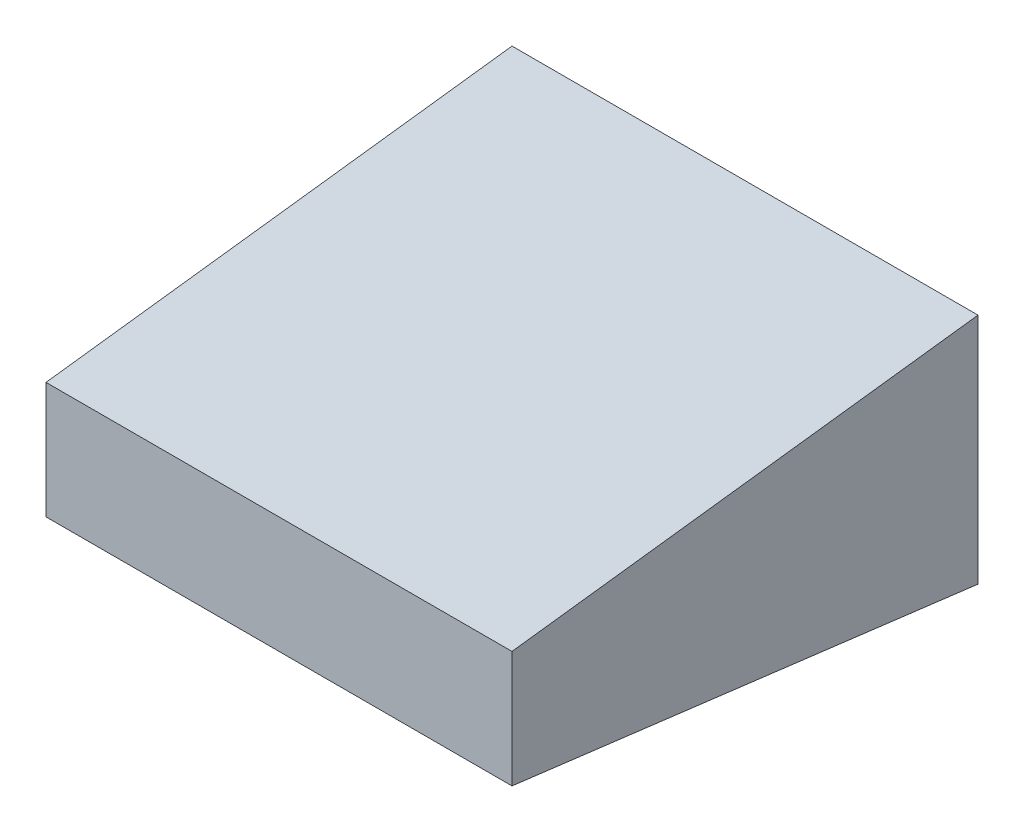
ISO-10303-21;
HEADER;
FILE_DESCRIPTION(('STEP AP214'),'2;1');
FILE_NAME('part.step','',(''),(''),'','','');
FILE_SCHEMA(('AUTOMOTIVE_DESIGN { 1 0 10303 214 1 1 1 1 }'));
ENDSEC;
DATA;
#1=APPLICATION_CONTEXT('core data for automotive mechanical design processes');
#2=APPLICATION_PROTOCOL_DEFINITION('international standard','automotive_design',2000,#1);
#3=PRODUCT_CONTEXT('',#1,'mechanical');
#4=PRODUCT('Part','Part','',(#3));
#5=PRODUCT_RELATED_PRODUCT_CATEGORY('part','',(#4));
#6=PRODUCT_DEFINITION_FORMATION('','',#4);
#7=PRODUCT_DEFINITION_CONTEXT('part definition',#1,'design');
#8=PRODUCT_DEFINITION('design','',#6,#7);
#9=PRODUCT_DEFINITION_SHAPE('','',#8);
#10=(LENGTH_UNIT() NAMED_UNIT(*) SI_UNIT(.MILLI.,.METRE.));
#11=(NAMED_UNIT(*) PLANE_ANGLE_UNIT() SI_UNIT($,.RADIAN.));
#12=(NAMED_UNIT(*) SI_UNIT($,.STERADIAN.) SOLID_ANGLE_UNIT());
#13=UNCERTAINTY_MEASURE_WITH_UNIT(LENGTH_MEASURE(1.E-05),#10,'distance_accuracy_value','');
#14=(GEOMETRIC_REPRESENTATION_CONTEXT(3) GLOBAL_UNCERTAINTY_ASSIGNED_CONTEXT((#13)) GLOBAL_UNIT_ASSIGNED_CONTEXT((#10,
#11,#12)) REPRESENTATION_CONTEXT('',''));
#15=CARTESIAN_POINT('',(0.,0.,0.));
#16=DIRECTION('',(0.,0.,1.));
#17=DIRECTION('',(1.,0.,0.));
#18=AXIS2_PLACEMENT_3D('',#15,#16,#17);
#19=CARTESIAN_POINT('',(-100.,50.,200.));
#20=DIRECTION('',(1.,0.,0.));
#21=DIRECTION('',(0.,0.,-1.));
#22=AXIS2_PLACEMENT_3D('',#19,#20,#21);
#23=PLANE('',#22);
#24=DIRECTION('',(0.,-1.,0.));
#25=VECTOR('',#24,1.);
#26=CARTESIAN_POINT('',(-100.,50.,0.));
#27=LINE('',#26,#25);
#28=CARTESIAN_POINT('',(-100.,50.,0.));
#29=VERTEX_POINT('',#28);
#30=CARTESIAN_POINT('',(-100.,-50.,0.));
#31=VERTEX_POINT('',#30);
#32=EDGE_CURVE('E126',#29,#31,#27,.T.);
#33=ORIENTED_EDGE('',*,*,#32,.T.);
#34=DIRECTION('',(0.,-0.124034734589208,-0.992277876713668));
#35=VECTOR('',#34,1.);
#36=CARTESIAN_POINT('',(-100.,-25.,200.));
#37=LINE('',#36,#35);
#38=CARTESIAN_POINT('',(-100.,-25.,200.));
#39=VERTEX_POINT('',#38);
#40=EDGE_CURVE('E101',#39,#31,#37,.T.);
#41=ORIENTED_EDGE('',*,*,#40,.F.);
#42=DIRECTION('',(0.,-1.,0.));
#43=VECTOR('',#42,1.);
#44=CARTESIAN_POINT('',(-100.,50.,200.));
#45=LINE('',#44,#43);
#46=CARTESIAN_POINT('',(-100.,25.,200.));
#47=VERTEX_POINT('',#46);
#48=EDGE_CURVE('E139',#47,#39,#45,.T.);
#49=ORIENTED_EDGE('',*,*,#48,.F.);
#50=DIRECTION('',(0.,0.124034734589208,-0.992277876713668));
#51=VECTOR('',#50,1.);
#52=CARTESIAN_POINT('',(-100.,25.,200.));
#53=LINE('',#52,#51);
#54=EDGE_CURVE('E174',#47,#29,#53,.T.);
#55=ORIENTED_EDGE('',*,*,#54,.T.);
#56=EDGE_LOOP('',(#33,#41,#49,#55));
#57=FACE_BOUND('',#56,.T.);
#58=ADVANCED_FACE('F39',(#57),#23,.F.);
#59=CARTESIAN_POINT('',(100.,50.,200.));
#60=DIRECTION('',(1.,0.,0.));
#61=DIRECTION('',(0.,0.,-1.));
#62=AXIS2_PLACEMENT_3D('',#59,#60,#61);
#63=PLANE('',#62);
#64=DIRECTION('',(0.,-0.124034734589208,-0.992277876713668));
#65=VECTOR('',#64,1.);
#66=CARTESIAN_POINT('',(100.,-25.,200.));
#67=LINE('',#66,#65);
#68=CARTESIAN_POINT('',(100.,-25.,200.));
#69=VERTEX_POINT('',#68);
#70=CARTESIAN_POINT('',(100.,-50.,0.));
#71=VERTEX_POINT('',#70);
#72=EDGE_CURVE('E119',#69,#71,#67,.T.);
#73=ORIENTED_EDGE('',*,*,#72,.T.);
#74=DIRECTION('',(0.,-1.,0.));
#75=VECTOR('',#74,1.);
#76=CARTESIAN_POINT('',(100.,50.,0.));
#77=LINE('',#76,#75);
#78=CARTESIAN_POINT('',(100.,50.,0.));
#79=VERTEX_POINT('',#78);
#80=EDGE_CURVE('E125',#79,#71,#77,.T.);
#81=ORIENTED_EDGE('',*,*,#80,.F.);
#82=DIRECTION('',(0.,0.124034734589208,-0.992277876713668));
#83=VECTOR('',#82,1.);
#84=CARTESIAN_POINT('',(100.,25.,200.));
#85=LINE('',#84,#83);
#86=CARTESIAN_POINT('',(100.,25.,200.));
#87=VERTEX_POINT('',#86);
#88=EDGE_CURVE('E93',#87,#79,#85,.T.);
#89=ORIENTED_EDGE('',*,*,#88,.F.);
#90=DIRECTION('',(0.,-1.,0.));
#91=VECTOR('',#90,1.);
#92=CARTESIAN_POINT('',(100.,50.,200.));
#93=LINE('',#92,#91);
#94=EDGE_CURVE('E133',#87,#69,#93,.T.);
#95=ORIENTED_EDGE('',*,*,#94,.T.);
#96=EDGE_LOOP('',(#73,#81,#89,#95));
#97=FACE_BOUND('',#96,.T.);
#98=ADVANCED_FACE('F130',(#97),#63,.T.);
#99=CARTESIAN_POINT('',(0.,0.,200.));
#100=DIRECTION('',(0.,0.,1.));
#101=DIRECTION('',(1.,0.,0.));
#102=AXIS2_PLACEMENT_3D('',#99,#100,#101);
#103=PLANE('',#102);
#104=DIRECTION('',(-1.,0.,0.));
#105=VECTOR('',#104,1.);
#106=CARTESIAN_POINT('',(100.,-25.,200.));
#107=LINE('',#106,#105);
#108=EDGE_CURVE('E134',#69,#39,#107,.T.);
#109=ORIENTED_EDGE('',*,*,#108,.F.);
#110=ORIENTED_EDGE('',*,*,#94,.F.);
#111=DIRECTION('',(-1.,0.,0.));
#112=VECTOR('',#111,1.);
#113=CARTESIAN_POINT('',(100.,25.,200.));
#114=LINE('',#113,#112);
#115=EDGE_CURVE('E168',#87,#47,#114,.T.);
#116=ORIENTED_EDGE('',*,*,#115,.T.);
#117=ORIENTED_EDGE('',*,*,#48,.T.);
#118=EDGE_LOOP('',(#109,#110,#116,#117));
#119=FACE_BOUND('',#118,.T.);
#120=ADVANCED_FACE('F179',(#119),#103,.T.);
#121=CARTESIAN_POINT('',(0.,0.,0.));
#122=DIRECTION('',(0.,0.,1.));
#123=DIRECTION('',(1.,0.,0.));
#124=AXIS2_PLACEMENT_3D('',#121,#122,#123);
#125=PLANE('',#124);
#126=ORIENTED_EDGE('',*,*,#32,.F.);
#127=DIRECTION('',(1.,0.,0.));
#128=VECTOR('',#127,1.);
#129=CARTESIAN_POINT('',(-100.,50.,0.));
#130=LINE('',#129,#128);
#131=EDGE_CURVE('E137',#29,#79,#130,.T.);
#132=ORIENTED_EDGE('',*,*,#131,.T.);
#133=ORIENTED_EDGE('',*,*,#80,.T.);
#134=DIRECTION('',(1.,0.,0.));
#135=VECTOR('',#134,1.);
#136=CARTESIAN_POINT('',(-100.,-50.,0.));
#137=LINE('',#136,#135);
#138=EDGE_CURVE('E116',#31,#71,#137,.T.);
#139=ORIENTED_EDGE('',*,*,#138,.F.);
#140=EDGE_LOOP('',(#126,#132,#133,#139));
#141=FACE_BOUND('',#140,.T.);
#142=ADVANCED_FACE('F136',(#141),#125,.F.);
#143=CARTESIAN_POINT('',(100.,25.,200.));
#144=DIRECTION('',(0.,0.992277876713668,0.124034734589208));
#145=DIRECTION('',(0.,-0.124034734589208,0.992277876713668));
#146=AXIS2_PLACEMENT_3D('',#143,#144,#145);
#147=PLANE('',#146);
#148=ORIENTED_EDGE('',*,*,#54,.F.);
#149=ORIENTED_EDGE('',*,*,#115,.F.);
#150=ORIENTED_EDGE('',*,*,#88,.T.);
#151=ORIENTED_EDGE('',*,*,#131,.F.);
#152=EDGE_LOOP('',(#148,#149,#150,#151));
#153=FACE_BOUND('',#152,.T.);
#154=ADVANCED_FACE('F186',(#153),#147,.T.);
#155=CARTESIAN_POINT('',(100.,-25.,200.));
#156=DIRECTION('',(0.,0.992277876713668,-0.124034734589208));
#157=DIRECTION('',(0.,0.124034734589208,0.992277876713668));
#158=AXIS2_PLACEMENT_3D('',#155,#156,#157);
#159=PLANE('',#158);
#160=ORIENTED_EDGE('',*,*,#40,.T.);
#161=ORIENTED_EDGE('',*,*,#138,.T.);
#162=ORIENTED_EDGE('',*,*,#72,.F.);
#163=ORIENTED_EDGE('',*,*,#108,.T.);
#164=EDGE_LOOP('',(#160,#161,#162,#163));
#165=FACE_BOUND('',#164,.T.);
#166=ADVANCED_FACE('F118',(#165),#159,.F.);
#167=CLOSED_SHELL('',(#58,#98,#120,#142,#154,#166));
#168=CARTESIAN_POINT('',(-96.,50.,200.));
#169=DIRECTION('',(1.,0.,0.));
#170=DIRECTION('',(0.,0.,-1.));
#171=AXIS2_PLACEMENT_3D('',#168,#169,#170);
#172=PLANE('',#171);
#173=DIRECTION('',(0.,-1.,0.));
#174=VECTOR('',#173,1.);
#175=CARTESIAN_POINT('',(-96.,50.,4.));
#176=LINE('',#175,#174);
#177=CARTESIAN_POINT('',(-96.,45.4688711258507,4.));
#178=VERTEX_POINT('',#177);
#179=CARTESIAN_POINT('',(-96.,-45.4688711258507,4.));
#180=VERTEX_POINT('',#179);
#181=EDGE_CURVE('E43',#178,#180,#176,.T.);
#182=ORIENTED_EDGE('',*,*,#181,.F.);
#183=DIRECTION('',(0.,0.124034734589208,-0.992277876713668));
#184=VECTOR('',#183,1.);
#185=CARTESIAN_POINT('',(-96.,21.0308884931453,199.503861061643));
#186=LINE('',#185,#184);
#187=CARTESIAN_POINT('',(-96.,21.4688711258507,196.));
#188=VERTEX_POINT('',#187);
#189=EDGE_CURVE('E86',#188,#178,#186,.T.);
#190=ORIENTED_EDGE('',*,*,#189,.F.);
#191=DIRECTION('',(0.,-1.,0.));
#192=VECTOR('',#191,1.);
#193=CARTESIAN_POINT('',(-96.,50.,196.));
#194=LINE('',#193,#192);
#195=CARTESIAN_POINT('',(-96.,-21.4688711258507,196.));
#196=VERTEX_POINT('',#195);
#197=EDGE_CURVE('E154',#188,#196,#194,.T.);
#198=ORIENTED_EDGE('',*,*,#197,.T.);
#199=DIRECTION('',(0.,-0.124034734589208,-0.992277876713668));
#200=VECTOR('',#199,1.);
#201=CARTESIAN_POINT('',(-96.,-21.0308884931453,199.503861061643));
#202=LINE('',#201,#200);
#203=EDGE_CURVE('E144',#196,#180,#202,.T.);
#204=ORIENTED_EDGE('',*,*,#203,.T.);
#205=EDGE_LOOP('',(#182,#190,#198,#204));
#206=FACE_BOUND('',#205,.T.);
#207=ADVANCED_FACE('F195',(#206),#172,.T.);
#208=CARTESIAN_POINT('',(96.,50.,200.));
#209=DIRECTION('',(1.,0.,0.));
#210=DIRECTION('',(0.,0.,-1.));
#211=AXIS2_PLACEMENT_3D('',#208,#209,#210);
#212=PLANE('',#211);
#213=DIRECTION('',(0.,-0.124034734589208,-0.992277876713668));
#214=VECTOR('',#213,1.);
#215=CARTESIAN_POINT('',(96.,-21.0308884931453,199.503861061643));
#216=LINE('',#215,#214);
#217=CARTESIAN_POINT('',(96.,-21.4688711258507,196.));
#218=VERTEX_POINT('',#217);
#219=CARTESIAN_POINT('',(96.,-45.4688711258507,4.));
#220=VERTEX_POINT('',#219);
#221=EDGE_CURVE('E159',#218,#220,#216,.T.);
#222=ORIENTED_EDGE('',*,*,#221,.F.);
#223=DIRECTION('',(0.,-1.,0.));
#224=VECTOR('',#223,1.);
#225=CARTESIAN_POINT('',(96.,50.,196.));
#226=LINE('',#225,#224);
#227=CARTESIAN_POINT('',(96.,21.4688711258507,196.));
#228=VERTEX_POINT('',#227);
#229=EDGE_CURVE('E157',#228,#218,#226,.T.);
#230=ORIENTED_EDGE('',*,*,#229,.F.);
#231=DIRECTION('',(0.,0.124034734589208,-0.992277876713668));
#232=VECTOR('',#231,1.);
#233=CARTESIAN_POINT('',(96.,21.0308884931453,199.503861061643));
#234=LINE('',#233,#232);
#235=CARTESIAN_POINT('',(96.,45.4688711258507,4.));
#236=VERTEX_POINT('',#235);
#237=EDGE_CURVE('E146',#228,#236,#234,.T.);
#238=ORIENTED_EDGE('',*,*,#237,.T.);
#239=DIRECTION('',(0.,-1.,0.));
#240=VECTOR('',#239,1.);
#241=CARTESIAN_POINT('',(96.,50.,4.));
#242=LINE('',#241,#240);
#243=EDGE_CURVE('E148',#236,#220,#242,.T.);
#244=ORIENTED_EDGE('',*,*,#243,.T.);
#245=EDGE_LOOP('',(#222,#230,#238,#244));
#246=FACE_BOUND('',#245,.T.);
#247=ADVANCED_FACE('F198',(#246),#212,.F.);
#248=CARTESIAN_POINT('',(0.,0.,196.));
#249=DIRECTION('',(0.,0.,1.));
#250=DIRECTION('',(1.,0.,0.));
#251=AXIS2_PLACEMENT_3D('',#248,#249,#250);
#252=PLANE('',#251);
#253=DIRECTION('',(-1.,0.,0.));
#254=VECTOR('',#253,1.);
#255=CARTESIAN_POINT('',(0.,-21.4688711258507,196.));
#256=LINE('',#255,#254);
#257=EDGE_CURVE('E11',#218,#196,#256,.T.);
#258=ORIENTED_EDGE('',*,*,#257,.T.);
#259=ORIENTED_EDGE('',*,*,#197,.F.);
#260=DIRECTION('',(-1.,0.,0.));
#261=VECTOR('',#260,1.);
#262=CARTESIAN_POINT('',(0.,21.4688711258507,196.));
#263=LINE('',#262,#261);
#264=EDGE_CURVE('E79',#228,#188,#263,.T.);
#265=ORIENTED_EDGE('',*,*,#264,.F.);
#266=ORIENTED_EDGE('',*,*,#229,.T.);
#267=EDGE_LOOP('',(#258,#259,#265,#266));
#268=FACE_BOUND('',#267,.T.);
#269=ADVANCED_FACE('F202',(#268),#252,.F.);
#270=CARTESIAN_POINT('',(0.,0.,4.));
#271=DIRECTION('',(0.,0.,1.));
#272=DIRECTION('',(1.,0.,0.));
#273=AXIS2_PLACEMENT_3D('',#270,#271,#272);
#274=PLANE('',#273);
#275=ORIENTED_EDGE('',*,*,#181,.T.);
#276=DIRECTION('',(1.,0.,0.));
#277=VECTOR('',#276,1.);
#278=CARTESIAN_POINT('',(100.,-45.4688711258507,4.));
#279=LINE('',#278,#277);
#280=EDGE_CURVE('E50',#180,#220,#279,.T.);
#281=ORIENTED_EDGE('',*,*,#280,.T.);
#282=ORIENTED_EDGE('',*,*,#243,.F.);
#283=DIRECTION('',(1.,0.,0.));
#284=VECTOR('',#283,1.);
#285=CARTESIAN_POINT('',(100.,45.4688711258507,4.));
#286=LINE('',#285,#284);
#287=EDGE_CURVE('E151',#178,#236,#286,.T.);
#288=ORIENTED_EDGE('',*,*,#287,.F.);
#289=EDGE_LOOP('',(#275,#281,#282,#288));
#290=FACE_BOUND('',#289,.T.);
#291=ADVANCED_FACE('F206',(#290),#274,.T.);
#292=CARTESIAN_POINT('',(100.,21.0308884931453,199.503861061643));
#293=DIRECTION('',(0.,0.992277876713668,0.124034734589208));
#294=DIRECTION('',(0.,-0.124034734589208,0.992277876713668));
#295=AXIS2_PLACEMENT_3D('',#292,#293,#294);
#296=PLANE('',#295);
#297=ORIENTED_EDGE('',*,*,#189,.T.);
#298=ORIENTED_EDGE('',*,*,#287,.T.);
#299=ORIENTED_EDGE('',*,*,#237,.F.);
#300=ORIENTED_EDGE('',*,*,#264,.T.);
#301=EDGE_LOOP('',(#297,#298,#299,#300));
#302=FACE_BOUND('',#301,.T.);
#303=ADVANCED_FACE('F208',(#302),#296,.F.);
#304=CARTESIAN_POINT('',(100.,-21.0308884931453,199.503861061643));
#305=DIRECTION('',(0.,0.992277876713668,-0.124034734589208));
#306=DIRECTION('',(0.,0.124034734589208,0.992277876713668));
#307=AXIS2_PLACEMENT_3D('',#304,#305,#306);
#308=PLANE('',#307);
#309=ORIENTED_EDGE('',*,*,#203,.F.);
#310=ORIENTED_EDGE('',*,*,#257,.F.);
#311=ORIENTED_EDGE('',*,*,#221,.T.);
#312=ORIENTED_EDGE('',*,*,#280,.F.);
#313=EDGE_LOOP('',(#309,#310,#311,#312));
#314=FACE_BOUND('',#313,.T.);
#315=ADVANCED_FACE('F41',(#314),#308,.T.);
#316=CLOSED_SHELL('',(#207,#247,#269,#291,#303,#315));
#317=ORIENTED_CLOSED_SHELL('',*,#316,.T.);
#318=BREP_WITH_VOIDS('B2',#167,(#317));
#319=ADVANCED_BREP_SHAPE_REPRESENTATION('',(#18,#318),#14);
#320=SHAPE_DEFINITION_REPRESENTATION(#9,#319);
ENDSEC;
END-ISO-10303-21;
